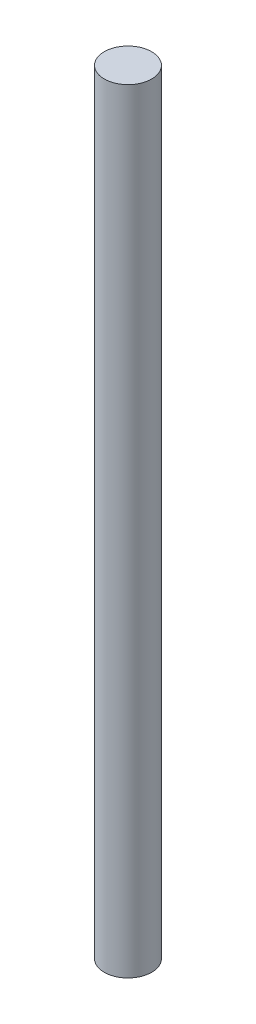
ISO-10303-21;
HEADER;
FILE_DESCRIPTION(('STEP AP214'),'2;1');
FILE_NAME('part.step','',(''),(''),'','','');
FILE_SCHEMA(('AUTOMOTIVE_DESIGN { 1 0 10303 214 1 1 1 1 }'));
ENDSEC;
DATA;
#1=APPLICATION_CONTEXT('core data for automotive mechanical design processes');
#2=APPLICATION_PROTOCOL_DEFINITION('international standard','automotive_design',2000,#1);
#3=PRODUCT_CONTEXT('',#1,'mechanical');
#4=PRODUCT('Part','Part','',(#3));
#5=PRODUCT_RELATED_PRODUCT_CATEGORY('part','',(#4));
#6=PRODUCT_DEFINITION_FORMATION('','',#4);
#7=PRODUCT_DEFINITION_CONTEXT('part definition',#1,'design');
#8=PRODUCT_DEFINITION('design','',#6,#7);
#9=PRODUCT_DEFINITION_SHAPE('','',#8);
#10=(LENGTH_UNIT() NAMED_UNIT(*) SI_UNIT(.MILLI.,.METRE.));
#11=(NAMED_UNIT(*) PLANE_ANGLE_UNIT() SI_UNIT($,.RADIAN.));
#12=(NAMED_UNIT(*) SI_UNIT($,.STERADIAN.) SOLID_ANGLE_UNIT());
#13=UNCERTAINTY_MEASURE_WITH_UNIT(LENGTH_MEASURE(1.E-05),#10,'distance_accuracy_value','');
#14=(GEOMETRIC_REPRESENTATION_CONTEXT(3) GLOBAL_UNCERTAINTY_ASSIGNED_CONTEXT((#13)) GLOBAL_UNIT_ASSIGNED_CONTEXT((#10,
#11,#12)) REPRESENTATION_CONTEXT('',''));
#15=CARTESIAN_POINT('',(0.,0.,0.));
#16=DIRECTION('',(0.,0.,1.));
#17=DIRECTION('',(1.,0.,0.));
#18=AXIS2_PLACEMENT_3D('',#15,#16,#17);
#19=CARTESIAN_POINT('',(0.,49.,0.));
#20=DIRECTION('',(0.,-1.,0.));
#21=DIRECTION('',(0.,0.,-1.));
#22=AXIS2_PLACEMENT_3D('',#19,#20,#21);
#23=CYLINDRICAL_SURFACE('',#22,1.5);
#24=CARTESIAN_POINT('',(0.,49.,0.));
#25=DIRECTION('',(0.,1.,0.));
#26=DIRECTION('',(0.,0.,1.));
#27=AXIS2_PLACEMENT_3D('',#24,#25,#26);
#28=CIRCLE('',#27,1.5);
#29=CARTESIAN_POINT('',(0.,49.,1.5));
#30=VERTEX_POINT('',#29);
#31=EDGE_CURVE('E10',#30,#30,#28,.T.);
#32=ORIENTED_EDGE('',*,*,#31,.F.);
#33=EDGE_LOOP('',(#32));
#34=FACE_BOUND('',#33,.T.);
#35=CARTESIAN_POINT('',(0.,0.,0.));
#36=DIRECTION('',(0.,1.,0.));
#37=DIRECTION('',(0.,0.,1.));
#38=AXIS2_PLACEMENT_3D('',#35,#36,#37);
#39=CIRCLE('',#38,1.5);
#40=CARTESIAN_POINT('',(0.,0.,1.5));
#41=VERTEX_POINT('',#40);
#42=EDGE_CURVE('E33',#41,#41,#39,.T.);
#43=ORIENTED_EDGE('',*,*,#42,.T.);
#44=EDGE_LOOP('',(#43));
#45=FACE_BOUND('',#44,.T.);
#46=ADVANCED_FACE('F30',(#34,#45),#23,.T.);
#47=CARTESIAN_POINT('',(0.,49.,0.));
#48=DIRECTION('',(0.,1.,0.));
#49=DIRECTION('',(0.,0.,1.));
#50=AXIS2_PLACEMENT_3D('',#47,#48,#49);
#51=PLANE('',#50);
#52=ORIENTED_EDGE('',*,*,#31,.T.);
#53=EDGE_LOOP('',(#52));
#54=FACE_BOUND('',#53,.T.);
#55=ADVANCED_FACE('F45',(#54),#51,.T.);
#56=CARTESIAN_POINT('',(0.,0.,0.));
#57=DIRECTION('',(0.,1.,0.));
#58=DIRECTION('',(0.,0.,1.));
#59=AXIS2_PLACEMENT_3D('',#56,#57,#58);
#60=PLANE('',#59);
#61=ORIENTED_EDGE('',*,*,#42,.F.);
#62=EDGE_LOOP('',(#61));
#63=FACE_BOUND('',#62,.T.);
#64=ADVANCED_FACE('F43',(#63),#60,.F.);
#65=CLOSED_SHELL('',(#46,#55,#64));
#66=MANIFOLD_SOLID_BREP('B2',#65);
#67=ADVANCED_BREP_SHAPE_REPRESENTATION('',(#18,#66),#14);
#68=SHAPE_DEFINITION_REPRESENTATION(#9,#67);
ENDSEC;
END-ISO-10303-21;
